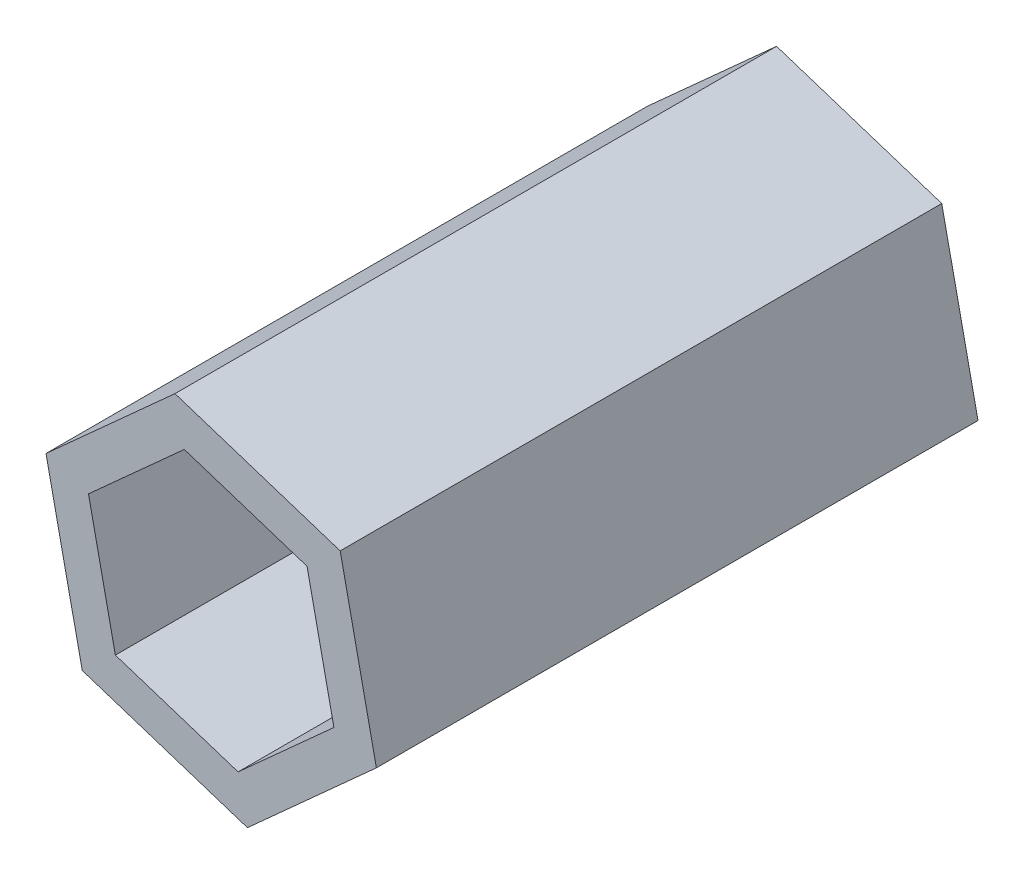
ISO-10303-21;
HEADER;
FILE_DESCRIPTION(('STEP AP214'),'2;1');
FILE_NAME('part.step','',(''),(''),'','','');
FILE_SCHEMA(('AUTOMOTIVE_DESIGN { 1 0 10303 214 1 1 1 1 }'));
ENDSEC;
DATA;
#1=APPLICATION_CONTEXT('core data for automotive mechanical design processes');
#2=APPLICATION_PROTOCOL_DEFINITION('international standard','automotive_design',2000,#1);
#3=PRODUCT_CONTEXT('',#1,'mechanical');
#4=PRODUCT('Part','Part','',(#3));
#5=PRODUCT_RELATED_PRODUCT_CATEGORY('part','',(#4));
#6=PRODUCT_DEFINITION_FORMATION('','',#4);
#7=PRODUCT_DEFINITION_CONTEXT('part definition',#1,'design');
#8=PRODUCT_DEFINITION('design','',#6,#7);
#9=PRODUCT_DEFINITION_SHAPE('','',#8);
#10=(LENGTH_UNIT() NAMED_UNIT(*) SI_UNIT(.MILLI.,.METRE.));
#11=(NAMED_UNIT(*) PLANE_ANGLE_UNIT() SI_UNIT($,.RADIAN.));
#12=(NAMED_UNIT(*) SI_UNIT($,.STERADIAN.) SOLID_ANGLE_UNIT());
#13=UNCERTAINTY_MEASURE_WITH_UNIT(LENGTH_MEASURE(1.E-05),#10,'distance_accuracy_value','');
#14=(GEOMETRIC_REPRESENTATION_CONTEXT(3) GLOBAL_UNCERTAINTY_ASSIGNED_CONTEXT((#13)) GLOBAL_UNIT_ASSIGNED_CONTEXT((#10,
#11,#12)) REPRESENTATION_CONTEXT('',''));
#15=CARTESIAN_POINT('',(0.,0.,0.));
#16=DIRECTION('',(0.,0.,1.));
#17=DIRECTION('',(1.,0.,0.));
#18=AXIS2_PLACEMENT_3D('',#15,#16,#17);
#19=CARTESIAN_POINT('',(3.00166839393673,2.70616337019305,14.));
#20=DIRECTION('',(-0.308413766503858,-0.95125230545366,0.));
#21=DIRECTION('',(0.95125230545366,-0.308413766503858,0.));
#22=AXIS2_PLACEMENT_3D('',#19,#20,#21);
#23=PLANE('',#22);
#24=DIRECTION('',(-0.95125230545366,0.308413766503858,0.));
#25=VECTOR('',#24,1.);
#26=CARTESIAN_POINT('',(3.00166839393673,2.70616337019305,0.));
#27=LINE('',#26,#25);
#28=CARTESIAN_POINT('',(3.00166839393673,2.70616337019305,0.));
#29=VERTEX_POINT('',#28);
#30=CARTESIAN_POINT('',(-0.842772028409732,3.95260276798257,0.));
#31=VERTEX_POINT('',#30);
#32=EDGE_CURVE('E129',#29,#31,#27,.T.);
#33=ORIENTED_EDGE('',*,*,#32,.T.);
#34=DIRECTION('',(0.,0.,-1.));
#35=VECTOR('',#34,1.);
#36=CARTESIAN_POINT('',(-0.842772028409732,3.95260276798257,14.));
#37=LINE('',#36,#35);
#38=CARTESIAN_POINT('',(-0.842772028409732,3.95260276798257,14.));
#39=VERTEX_POINT('',#38);
#40=EDGE_CURVE('E11',#39,#31,#37,.T.);
#41=ORIENTED_EDGE('',*,*,#40,.F.);
#42=DIRECTION('',(-0.95125230545366,0.308413766503858,0.));
#43=VECTOR('',#42,1.);
#44=CARTESIAN_POINT('',(3.00166839393673,2.70616337019305,14.));
#45=LINE('',#44,#43);
#46=CARTESIAN_POINT('',(3.00166839393673,2.70616337019305,14.));
#47=VERTEX_POINT('',#46);
#48=EDGE_CURVE('E141',#47,#39,#45,.T.);
#49=ORIENTED_EDGE('',*,*,#48,.F.);
#50=DIRECTION('',(0.,0.,-1.));
#51=VECTOR('',#50,1.);
#52=CARTESIAN_POINT('',(3.00166839393673,2.70616337019305,14.));
#53=LINE('',#52,#51);
#54=EDGE_CURVE('E125',#47,#29,#53,.T.);
#55=ORIENTED_EDGE('',*,*,#54,.T.);
#56=EDGE_LOOP('',(#33,#41,#49,#55));
#57=FACE_BOUND('',#56,.T.);
#58=ADVANCED_FACE('F33',(#57),#23,.F.);
#59=CARTESIAN_POINT('',(-0.842772028409732,3.95260276798257,14.));
#60=DIRECTION('',(0.669601778679456,-0.742720309396013,0.));
#61=DIRECTION('',(0.742720309396013,0.669601778679456,0.));
#62=AXIS2_PLACEMENT_3D('',#59,#60,#61);
#63=PLANE('',#62);
#64=DIRECTION('',(-0.742720309396013,-0.669601778679456,0.));
#65=VECTOR('',#64,1.);
#66=CARTESIAN_POINT('',(-0.842772028409732,3.95260276798257,0.));
#67=LINE('',#66,#65);
#68=CARTESIAN_POINT('',(-3.84444042234647,1.24643939778952,0.));
#69=VERTEX_POINT('',#68);
#70=EDGE_CURVE('E132',#31,#69,#67,.T.);
#71=ORIENTED_EDGE('',*,*,#70,.T.);
#72=DIRECTION('',(0.,0.,-1.));
#73=VECTOR('',#72,1.);
#74=CARTESIAN_POINT('',(-3.84444042234647,1.24643939778952,14.));
#75=LINE('',#74,#73);
#76=CARTESIAN_POINT('',(-3.84444042234647,1.24643939778952,14.));
#77=VERTEX_POINT('',#76);
#78=EDGE_CURVE('E40',#77,#69,#75,.T.);
#79=ORIENTED_EDGE('',*,*,#78,.F.);
#80=DIRECTION('',(-0.742720309396013,-0.669601778679456,0.));
#81=VECTOR('',#80,1.);
#82=CARTESIAN_POINT('',(-0.842772028409732,3.95260276798257,14.));
#83=LINE('',#82,#81);
#84=EDGE_CURVE('E91',#39,#77,#83,.T.);
#85=ORIENTED_EDGE('',*,*,#84,.F.);
#86=ORIENTED_EDGE('',*,*,#40,.T.);
#87=EDGE_LOOP('',(#71,#79,#85,#86));
#88=FACE_BOUND('',#87,.T.);
#89=ADVANCED_FACE('F229',(#88),#63,.F.);
#90=CARTESIAN_POINT('',(-3.84444042234647,1.24643939778952,14.));
#91=DIRECTION('',(0.978015545183313,0.208531996057647,0.));
#92=DIRECTION('',(-0.208531996057647,0.978015545183313,0.));
#93=AXIS2_PLACEMENT_3D('',#90,#91,#92);
#94=PLANE('',#93);
#95=DIRECTION('',(0.208531996057647,-0.978015545183313,0.));
#96=VECTOR('',#95,1.);
#97=CARTESIAN_POINT('',(-3.84444042234647,1.24643939778952,0.));
#98=LINE('',#97,#96);
#99=CARTESIAN_POINT('',(-3.00166839393674,-2.70616337019305,0.));
#100=VERTEX_POINT('',#99);
#101=EDGE_CURVE('E135',#69,#100,#98,.T.);
#102=ORIENTED_EDGE('',*,*,#101,.T.);
#103=DIRECTION('',(0.,0.,-1.));
#104=VECTOR('',#103,1.);
#105=CARTESIAN_POINT('',(-3.00166839393674,-2.70616337019305,14.));
#106=LINE('',#105,#104);
#107=CARTESIAN_POINT('',(-3.00166839393674,-2.70616337019305,14.));
#108=VERTEX_POINT('',#107);
#109=EDGE_CURVE('E120',#108,#100,#106,.T.);
#110=ORIENTED_EDGE('',*,*,#109,.F.);
#111=DIRECTION('',(0.208531996057647,-0.978015545183313,0.));
#112=VECTOR('',#111,1.);
#113=CARTESIAN_POINT('',(-3.84444042234647,1.24643939778952,14.));
#114=LINE('',#113,#112);
#115=EDGE_CURVE('E108',#77,#108,#114,.T.);
#116=ORIENTED_EDGE('',*,*,#115,.F.);
#117=ORIENTED_EDGE('',*,*,#78,.T.);
#118=EDGE_LOOP('',(#102,#110,#116,#117));
#119=FACE_BOUND('',#118,.T.);
#120=ADVANCED_FACE('F147',(#119),#94,.F.);
#121=CARTESIAN_POINT('',(-3.00166839393674,-2.70616337019305,14.));
#122=DIRECTION('',(0.308413766503858,0.95125230545366,0.));
#123=DIRECTION('',(-0.95125230545366,0.308413766503858,0.));
#124=AXIS2_PLACEMENT_3D('',#121,#122,#123);
#125=PLANE('',#124);
#126=DIRECTION('',(0.95125230545366,-0.308413766503858,0.));
#127=VECTOR('',#126,1.);
#128=CARTESIAN_POINT('',(-3.00166839393674,-2.70616337019305,0.));
#129=LINE('',#128,#127);
#130=CARTESIAN_POINT('',(0.842772028409723,-3.95260276798257,0.));
#131=VERTEX_POINT('',#130);
#132=EDGE_CURVE('E117',#100,#131,#129,.T.);
#133=ORIENTED_EDGE('',*,*,#132,.T.);
#134=DIRECTION('',(0.,0.,-1.));
#135=VECTOR('',#134,1.);
#136=CARTESIAN_POINT('',(0.842772028409723,-3.95260276798257,14.));
#137=LINE('',#136,#135);
#138=CARTESIAN_POINT('',(0.842772028409723,-3.95260276798257,14.));
#139=VERTEX_POINT('',#138);
#140=EDGE_CURVE('E114',#139,#131,#137,.T.);
#141=ORIENTED_EDGE('',*,*,#140,.F.);
#142=DIRECTION('',(0.95125230545366,-0.308413766503858,0.));
#143=VECTOR('',#142,1.);
#144=CARTESIAN_POINT('',(-3.00166839393674,-2.70616337019305,14.));
#145=LINE('',#144,#143);
#146=EDGE_CURVE('E101',#108,#139,#145,.T.);
#147=ORIENTED_EDGE('',*,*,#146,.F.);
#148=ORIENTED_EDGE('',*,*,#109,.T.);
#149=EDGE_LOOP('',(#133,#141,#147,#148));
#150=FACE_BOUND('',#149,.T.);
#151=ADVANCED_FACE('F115',(#150),#125,.F.);
#152=CARTESIAN_POINT('',(0.842772028409723,-3.95260276798257,14.));
#153=DIRECTION('',(-0.669601778679456,0.742720309396013,0.));
#154=DIRECTION('',(-0.742720309396013,-0.669601778679456,0.));
#155=AXIS2_PLACEMENT_3D('',#152,#153,#154);
#156=PLANE('',#155);
#157=DIRECTION('',(0.742720309396013,0.669601778679456,0.));
#158=VECTOR('',#157,1.);
#159=CARTESIAN_POINT('',(0.842772028409723,-3.95260276798257,0.));
#160=LINE('',#159,#158);
#161=CARTESIAN_POINT('',(3.84444042234646,-1.24643939778952,0.));
#162=VERTEX_POINT('',#161);
#163=EDGE_CURVE('E138',#131,#162,#160,.T.);
#164=ORIENTED_EDGE('',*,*,#163,.T.);
#165=DIRECTION('',(0.,0.,-1.));
#166=VECTOR('',#165,1.);
#167=CARTESIAN_POINT('',(3.84444042234646,-1.24643939778952,14.));
#168=LINE('',#167,#166);
#169=CARTESIAN_POINT('',(3.84444042234646,-1.24643939778952,14.));
#170=VERTEX_POINT('',#169);
#171=EDGE_CURVE('E121',#170,#162,#168,.T.);
#172=ORIENTED_EDGE('',*,*,#171,.F.);
#173=DIRECTION('',(0.742720309396013,0.669601778679456,0.));
#174=VECTOR('',#173,1.);
#175=CARTESIAN_POINT('',(0.842772028409723,-3.95260276798257,14.));
#176=LINE('',#175,#174);
#177=EDGE_CURVE('E105',#139,#170,#176,.T.);
#178=ORIENTED_EDGE('',*,*,#177,.F.);
#179=ORIENTED_EDGE('',*,*,#140,.T.);
#180=EDGE_LOOP('',(#164,#172,#178,#179));
#181=FACE_BOUND('',#180,.T.);
#182=ADVANCED_FACE('F123',(#181),#156,.F.);
#183=CARTESIAN_POINT('',(3.84444042234646,-1.24643939778952,14.));
#184=DIRECTION('',(-0.978015545183313,-0.208531996057647,0.));
#185=DIRECTION('',(0.208531996057647,-0.978015545183313,0.));
#186=AXIS2_PLACEMENT_3D('',#183,#184,#185);
#187=PLANE('',#186);
#188=DIRECTION('',(-0.208531996057647,0.978015545183313,0.));
#189=VECTOR('',#188,1.);
#190=CARTESIAN_POINT('',(3.84444042234646,-1.24643939778952,0.));
#191=LINE('',#190,#189);
#192=EDGE_CURVE('E83',#162,#29,#191,.T.);
#193=ORIENTED_EDGE('',*,*,#192,.T.);
#194=ORIENTED_EDGE('',*,*,#54,.F.);
#195=DIRECTION('',(-0.208531996057647,0.978015545183313,0.));
#196=VECTOR('',#195,1.);
#197=CARTESIAN_POINT('',(3.84444042234646,-1.24643939778952,14.));
#198=LINE('',#197,#196);
#199=EDGE_CURVE('E56',#170,#47,#198,.T.);
#200=ORIENTED_EDGE('',*,*,#199,.F.);
#201=ORIENTED_EDGE('',*,*,#171,.T.);
#202=EDGE_LOOP('',(#193,#194,#200,#201));
#203=FACE_BOUND('',#202,.T.);
#204=ADVANCED_FACE('F151',(#203),#187,.F.);
#205=CARTESIAN_POINT('',(0.,0.,14.));
#206=DIRECTION('',(0.,0.,1.));
#207=DIRECTION('',(1.,0.,0.));
#208=AXIS2_PLACEMENT_3D('',#205,#206,#207);
#209=PLANE('',#208);
#210=DIRECTION('',(-0.208531996057655,0.978015545183312,0.));
#211=VECTOR('',#210,1.);
#212=CARTESIAN_POINT('',(2.85587002802881,-0.925926409786481,14.));
#213=LINE('',#212,#211);
#214=CARTESIAN_POINT('',(2.85587002802881,-0.925926409786481,14.));
#215=VERTEX_POINT('',#214);
#216=CARTESIAN_POINT('',(2.22981080692441,2.01029278928628,14.));
#217=VERTEX_POINT('',#216);
#218=EDGE_CURVE('E47',#215,#217,#213,.T.);
#219=ORIENTED_EDGE('',*,*,#218,.F.);
#220=DIRECTION('',(0.742720309396008,0.669601778679461,0.));
#221=VECTOR('',#220,1.);
#222=CARTESIAN_POINT('',(0.626059221104392,-2.93621919907276,14.));
#223=LINE('',#222,#221);
#224=CARTESIAN_POINT('',(0.626059221104392,-2.93621919907276,14.));
#225=VERTEX_POINT('',#224);
#226=EDGE_CURVE('E174',#225,#215,#223,.T.);
#227=ORIENTED_EDGE('',*,*,#226,.F.);
#228=DIRECTION('',(0.951252305453663,-0.308413766503851,0.));
#229=VECTOR('',#228,1.);
#230=CARTESIAN_POINT('',(-2.22981080692441,-2.01029278928628,14.));
#231=LINE('',#230,#229);
#232=CARTESIAN_POINT('',(-2.22981080692441,-2.01029278928628,14.));
#233=VERTEX_POINT('',#232);
#234=EDGE_CURVE('E178',#233,#225,#231,.T.);
#235=ORIENTED_EDGE('',*,*,#234,.F.);
#236=DIRECTION('',(0.208531996057654,-0.978015545183312,0.));
#237=VECTOR('',#236,1.);
#238=CARTESIAN_POINT('',(-2.85587002802881,0.925926409786481,14.));
#239=LINE('',#238,#237);
#240=CARTESIAN_POINT('',(-2.85587002802881,0.925926409786481,14.));
#241=VERTEX_POINT('',#240);
#242=EDGE_CURVE('E181',#241,#233,#239,.T.);
#243=ORIENTED_EDGE('',*,*,#242,.F.);
#244=DIRECTION('',(-0.742720309396009,-0.669601778679461,0.));
#245=VECTOR('',#244,1.);
#246=CARTESIAN_POINT('',(-0.62605922110439,2.93621919907276,14.));
#247=LINE('',#246,#245);
#248=CARTESIAN_POINT('',(-0.62605922110439,2.93621919907276,14.));
#249=VERTEX_POINT('',#248);
#250=EDGE_CURVE('E184',#249,#241,#247,.T.);
#251=ORIENTED_EDGE('',*,*,#250,.F.);
#252=DIRECTION('',(-0.951252305453662,0.308413766503851,0.));
#253=VECTOR('',#252,1.);
#254=CARTESIAN_POINT('',(2.22981080692441,2.01029278928628,14.));
#255=LINE('',#254,#253);
#256=EDGE_CURVE('E187',#217,#249,#255,.T.);
#257=ORIENTED_EDGE('',*,*,#256,.F.);
#258=EDGE_LOOP('',(#219,#227,#235,#243,#251,#257));
#259=FACE_BOUND('',#258,.T.);
#260=ORIENTED_EDGE('',*,*,#48,.T.);
#261=ORIENTED_EDGE('',*,*,#84,.T.);
#262=ORIENTED_EDGE('',*,*,#115,.T.);
#263=ORIENTED_EDGE('',*,*,#146,.T.);
#264=ORIENTED_EDGE('',*,*,#177,.T.);
#265=ORIENTED_EDGE('',*,*,#199,.T.);
#266=EDGE_LOOP('',(#260,#261,#262,#263,#264,#265));
#267=FACE_BOUND('',#266,.T.);
#268=ADVANCED_FACE('F103',(#259,#267),#209,.T.);
#269=CARTESIAN_POINT('',(0.,0.,0.));
#270=DIRECTION('',(0.,0.,1.));
#271=DIRECTION('',(1.,0.,0.));
#272=AXIS2_PLACEMENT_3D('',#269,#270,#271);
#273=PLANE('',#272);
#274=CARTESIAN_POINT('',(0.,0.,0.));
#275=DIRECTION('',(0.,0.,-1.));
#276=DIRECTION('',(-1.,0.,0.));
#277=AXIS2_PLACEMENT_3D('',#274,#275,#276);
#278=CIRCLE('',#277,0.75);
#279=CARTESIAN_POINT('',(-0.75,0.,0.));
#280=VERTEX_POINT('',#279);
#281=EDGE_CURVE('E191',#280,#280,#278,.T.);
#282=ORIENTED_EDGE('',*,*,#281,.F.);
#283=EDGE_LOOP('',(#282));
#284=FACE_BOUND('',#283,.T.);
#285=ORIENTED_EDGE('',*,*,#32,.F.);
#286=ORIENTED_EDGE('',*,*,#192,.F.);
#287=ORIENTED_EDGE('',*,*,#163,.F.);
#288=ORIENTED_EDGE('',*,*,#132,.F.);
#289=ORIENTED_EDGE('',*,*,#101,.F.);
#290=ORIENTED_EDGE('',*,*,#70,.F.);
#291=EDGE_LOOP('',(#285,#286,#287,#288,#289,#290));
#292=FACE_BOUND('',#291,.T.);
#293=ADVANCED_FACE('F150',(#284,#292),#273,.F.);
#294=CARTESIAN_POINT('',(2.85587002802881,-0.925926409786481,3.4));
#295=DIRECTION('',(0.978015545183312,0.208531996057655,0.));
#296=DIRECTION('',(-0.208531996057655,0.978015545183312,0.));
#297=AXIS2_PLACEMENT_3D('',#294,#295,#296);
#298=PLANE('',#297);
#299=ORIENTED_EDGE('',*,*,#218,.T.);
#300=DIRECTION('',(0.,0.,1.));
#301=VECTOR('',#300,1.);
#302=CARTESIAN_POINT('',(2.22981080692441,2.01029278928628,3.4));
#303=LINE('',#302,#301);
#304=CARTESIAN_POINT('',(2.22981080692441,2.01029278928628,3.4));
#305=VERTEX_POINT('',#304);
#306=EDGE_CURVE('E158',#305,#217,#303,.T.);
#307=ORIENTED_EDGE('',*,*,#306,.F.);
#308=DIRECTION('',(-0.208531996057655,0.978015545183312,0.));
#309=VECTOR('',#308,1.);
#310=CARTESIAN_POINT('',(2.85587002802881,-0.925926409786481,3.4));
#311=LINE('',#310,#309);
#312=CARTESIAN_POINT('',(2.85587002802881,-0.925926409786481,3.4));
#313=VERTEX_POINT('',#312);
#314=EDGE_CURVE('E177',#313,#305,#311,.T.);
#315=ORIENTED_EDGE('',*,*,#314,.F.);
#316=DIRECTION('',(0.,0.,1.));
#317=VECTOR('',#316,1.);
#318=CARTESIAN_POINT('',(2.85587002802881,-0.925926409786481,3.4));
#319=LINE('',#318,#317);
#320=EDGE_CURVE('E133',#313,#215,#319,.T.);
#321=ORIENTED_EDGE('',*,*,#320,.T.);
#322=EDGE_LOOP('',(#299,#307,#315,#321));
#323=FACE_BOUND('',#322,.T.);
#324=ADVANCED_FACE('F217',(#323),#298,.F.);
#325=CARTESIAN_POINT('',(0.626059221104392,-2.93621919907276,3.4));
#326=DIRECTION('',(0.669601778679461,-0.742720309396008,0.));
#327=DIRECTION('',(0.742720309396009,0.669601778679461,0.));
#328=AXIS2_PLACEMENT_3D('',#325,#326,#327);
#329=PLANE('',#328);
#330=ORIENTED_EDGE('',*,*,#226,.T.);
#331=ORIENTED_EDGE('',*,*,#320,.F.);
#332=DIRECTION('',(0.742720309396008,0.669601778679461,0.));
#333=VECTOR('',#332,1.);
#334=CARTESIAN_POINT('',(0.626059221104392,-2.93621919907276,3.4));
#335=LINE('',#334,#333);
#336=CARTESIAN_POINT('',(0.626059221104392,-2.93621919907276,3.4));
#337=VERTEX_POINT('',#336);
#338=EDGE_CURVE('E161',#337,#313,#335,.T.);
#339=ORIENTED_EDGE('',*,*,#338,.F.);
#340=DIRECTION('',(0.,0.,1.));
#341=VECTOR('',#340,1.);
#342=CARTESIAN_POINT('',(0.626059221104392,-2.93621919907276,3.4));
#343=LINE('',#342,#341);
#344=EDGE_CURVE('E170',#337,#225,#343,.T.);
#345=ORIENTED_EDGE('',*,*,#344,.T.);
#346=EDGE_LOOP('',(#330,#331,#339,#345));
#347=FACE_BOUND('',#346,.T.);
#348=ADVANCED_FACE('F223',(#347),#329,.F.);
#349=CARTESIAN_POINT('',(-2.22981080692441,-2.01029278928628,3.4));
#350=DIRECTION('',(-0.308413766503851,-0.951252305453663,0.));
#351=DIRECTION('',(0.951252305453663,-0.308413766503851,0.));
#352=AXIS2_PLACEMENT_3D('',#349,#350,#351);
#353=PLANE('',#352);
#354=ORIENTED_EDGE('',*,*,#234,.T.);
#355=ORIENTED_EDGE('',*,*,#344,.F.);
#356=DIRECTION('',(0.951252305453663,-0.308413766503851,0.));
#357=VECTOR('',#356,1.);
#358=CARTESIAN_POINT('',(-2.22981080692441,-2.01029278928628,3.4));
#359=LINE('',#358,#357);
#360=CARTESIAN_POINT('',(-2.22981080692441,-2.01029278928628,3.4));
#361=VERTEX_POINT('',#360);
#362=EDGE_CURVE('E194',#361,#337,#359,.T.);
#363=ORIENTED_EDGE('',*,*,#362,.F.);
#364=DIRECTION('',(0.,0.,1.));
#365=VECTOR('',#364,1.);
#366=CARTESIAN_POINT('',(-2.22981080692441,-2.01029278928628,3.4));
#367=LINE('',#366,#365);
#368=EDGE_CURVE('E167',#361,#233,#367,.T.);
#369=ORIENTED_EDGE('',*,*,#368,.T.);
#370=EDGE_LOOP('',(#354,#355,#363,#369));
#371=FACE_BOUND('',#370,.T.);
#372=ADVANCED_FACE('F266',(#371),#353,.F.);
#373=CARTESIAN_POINT('',(-2.85587002802881,0.925926409786481,3.4));
#374=DIRECTION('',(-0.978015545183312,-0.208531996057654,0.));
#375=DIRECTION('',(0.208531996057654,-0.978015545183312,0.));
#376=AXIS2_PLACEMENT_3D('',#373,#374,#375);
#377=PLANE('',#376);
#378=ORIENTED_EDGE('',*,*,#242,.T.);
#379=ORIENTED_EDGE('',*,*,#368,.F.);
#380=DIRECTION('',(0.208531996057654,-0.978015545183312,0.));
#381=VECTOR('',#380,1.);
#382=CARTESIAN_POINT('',(-2.85587002802881,0.925926409786481,3.4));
#383=LINE('',#382,#381);
#384=CARTESIAN_POINT('',(-2.85587002802881,0.925926409786481,3.4));
#385=VERTEX_POINT('',#384);
#386=EDGE_CURVE('E197',#385,#361,#383,.T.);
#387=ORIENTED_EDGE('',*,*,#386,.F.);
#388=DIRECTION('',(0.,0.,1.));
#389=VECTOR('',#388,1.);
#390=CARTESIAN_POINT('',(-2.85587002802881,0.925926409786481,3.4));
#391=LINE('',#390,#389);
#392=EDGE_CURVE('E164',#385,#241,#391,.T.);
#393=ORIENTED_EDGE('',*,*,#392,.T.);
#394=EDGE_LOOP('',(#378,#379,#387,#393));
#395=FACE_BOUND('',#394,.T.);
#396=ADVANCED_FACE('F276',(#395),#377,.F.);
#397=CARTESIAN_POINT('',(-0.62605922110439,2.93621919907276,3.4));
#398=DIRECTION('',(-0.669601778679461,0.742720309396009,0.));
#399=DIRECTION('',(-0.742720309396009,-0.669601778679461,0.));
#400=AXIS2_PLACEMENT_3D('',#397,#398,#399);
#401=PLANE('',#400);
#402=ORIENTED_EDGE('',*,*,#250,.T.);
#403=ORIENTED_EDGE('',*,*,#392,.F.);
#404=DIRECTION('',(-0.742720309396009,-0.669601778679461,0.));
#405=VECTOR('',#404,1.);
#406=CARTESIAN_POINT('',(-0.62605922110439,2.93621919907276,3.4));
#407=LINE('',#406,#405);
#408=CARTESIAN_POINT('',(-0.62605922110439,2.93621919907276,3.4));
#409=VERTEX_POINT('',#408);
#410=EDGE_CURVE('E200',#409,#385,#407,.T.);
#411=ORIENTED_EDGE('',*,*,#410,.F.);
#412=DIRECTION('',(0.,0.,1.));
#413=VECTOR('',#412,1.);
#414=CARTESIAN_POINT('',(-0.62605922110439,2.93621919907276,3.4));
#415=LINE('',#414,#413);
#416=EDGE_CURVE('E160',#409,#249,#415,.T.);
#417=ORIENTED_EDGE('',*,*,#416,.T.);
#418=EDGE_LOOP('',(#402,#403,#411,#417));
#419=FACE_BOUND('',#418,.T.);
#420=ADVANCED_FACE('F286',(#419),#401,.F.);
#421=CARTESIAN_POINT('',(2.22981080692441,2.01029278928628,3.4));
#422=DIRECTION('',(0.308413766503851,0.951252305453662,0.));
#423=DIRECTION('',(-0.951252305453663,0.308413766503851,0.));
#424=AXIS2_PLACEMENT_3D('',#421,#422,#423);
#425=PLANE('',#424);
#426=ORIENTED_EDGE('',*,*,#256,.T.);
#427=ORIENTED_EDGE('',*,*,#416,.F.);
#428=DIRECTION('',(-0.951252305453662,0.308413766503851,0.));
#429=VECTOR('',#428,1.);
#430=CARTESIAN_POINT('',(2.22981080692441,2.01029278928628,3.4));
#431=LINE('',#430,#429);
#432=EDGE_CURVE('E203',#305,#409,#431,.T.);
#433=ORIENTED_EDGE('',*,*,#432,.F.);
#434=ORIENTED_EDGE('',*,*,#306,.T.);
#435=EDGE_LOOP('',(#426,#427,#433,#434));
#436=FACE_BOUND('',#435,.T.);
#437=ADVANCED_FACE('F296',(#436),#425,.F.);
#438=CARTESIAN_POINT('',(0.,0.,3.4));
#439=DIRECTION('',(0.,0.,1.));
#440=DIRECTION('',(1.,0.,0.));
#441=AXIS2_PLACEMENT_3D('',#438,#439,#440);
#442=PLANE('',#441);
#443=CARTESIAN_POINT('',(0.,0.,3.4));
#444=DIRECTION('',(0.,0.,1.));
#445=DIRECTION('',(1.,0.,0.));
#446=AXIS2_PLACEMENT_3D('',#443,#444,#445);
#447=CIRCLE('',#446,0.75);
#448=CARTESIAN_POINT('',(-0.75,0.,3.4));
#449=VERTEX_POINT('',#448);
#450=EDGE_CURVE('E208',#449,#449,#447,.F.);
#451=ORIENTED_EDGE('',*,*,#450,.T.);
#452=EDGE_LOOP('',(#451));
#453=FACE_BOUND('',#452,.T.);
#454=ORIENTED_EDGE('',*,*,#314,.T.);
#455=ORIENTED_EDGE('',*,*,#432,.T.);
#456=ORIENTED_EDGE('',*,*,#410,.T.);
#457=ORIENTED_EDGE('',*,*,#386,.T.);
#458=ORIENTED_EDGE('',*,*,#362,.T.);
#459=ORIENTED_EDGE('',*,*,#338,.T.);
#460=EDGE_LOOP('',(#454,#455,#456,#457,#458,#459));
#461=FACE_BOUND('',#460,.T.);
#462=ADVANCED_FACE('F305',(#453,#461),#442,.T.);
#463=CARTESIAN_POINT('',(0.,0.,14.001));
#464=DIRECTION('',(0.,0.,-1.));
#465=DIRECTION('',(-1.,0.,0.));
#466=AXIS2_PLACEMENT_3D('',#463,#464,#465);
#467=CYLINDRICAL_SURFACE('',#466,0.75);
#468=CARTESIAN_POINT('',(-0.75,0.,3.4));
#469=CARTESIAN_POINT('',(-0.75,0.,3.36458333333333));
#470=CARTESIAN_POINT('',(-0.75,0.,3.32916666666666));
#471=CARTESIAN_POINT('',(-0.75,0.,3.25833333333333));
#472=CARTESIAN_POINT('',(-0.75,0.,3.22291666666667));
#473=CARTESIAN_POINT('',(-0.75,0.,3.15208333333333));
#474=CARTESIAN_POINT('',(-0.75,0.,3.11666666666667));
#475=CARTESIAN_POINT('',(-0.75,0.,3.04583333333333));
#476=CARTESIAN_POINT('',(-0.75,0.,3.01041666666667));
#477=CARTESIAN_POINT('',(-0.75,0.,2.93958333333333));
#478=CARTESIAN_POINT('',(-0.75,0.,2.90416666666667));
#479=CARTESIAN_POINT('',(-0.75,0.,2.83333333333333));
#480=CARTESIAN_POINT('',(-0.75,0.,2.79791666666667));
#481=CARTESIAN_POINT('',(-0.75,0.,2.72708333333333));
#482=CARTESIAN_POINT('',(-0.75,0.,2.69166666666667));
#483=CARTESIAN_POINT('',(-0.75,0.,2.62083333333333));
#484=CARTESIAN_POINT('',(-0.75,0.,2.58541666666666));
#485=CARTESIAN_POINT('',(-0.75,0.,2.51458333333333));
#486=CARTESIAN_POINT('',(-0.75,0.,2.47916666666667));
#487=CARTESIAN_POINT('',(-0.75,0.,2.40833333333333));
#488=CARTESIAN_POINT('',(-0.75,0.,2.37291666666667));
#489=CARTESIAN_POINT('',(-0.75,0.,2.30208333333333));
#490=CARTESIAN_POINT('',(-0.75,0.,2.26666666666667));
#491=CARTESIAN_POINT('',(-0.75,0.,2.19583333333333));
#492=CARTESIAN_POINT('',(-0.75,0.,2.16041666666667));
#493=CARTESIAN_POINT('',(-0.75,0.,2.08958333333333));
#494=CARTESIAN_POINT('',(-0.75,0.,2.05416666666667));
#495=CARTESIAN_POINT('',(-0.75,0.,1.98333333333333));
#496=CARTESIAN_POINT('',(-0.75,0.,1.94791666666667));
#497=CARTESIAN_POINT('',(-0.75,0.,1.87708333333333));
#498=CARTESIAN_POINT('',(-0.75,0.,1.84166666666667));
#499=CARTESIAN_POINT('',(-0.75,0.,1.77083333333333));
#500=CARTESIAN_POINT('',(-0.75,0.,1.73541666666667));
#501=CARTESIAN_POINT('',(-0.75,0.,1.66458333333333));
#502=CARTESIAN_POINT('',(-0.75,0.,1.62916666666667));
#503=CARTESIAN_POINT('',(-0.75,0.,1.55833333333333));
#504=CARTESIAN_POINT('',(-0.75,0.,1.52291666666667));
#505=CARTESIAN_POINT('',(-0.75,0.,1.45208333333333));
#506=CARTESIAN_POINT('',(-0.75,0.,1.41666666666667));
#507=CARTESIAN_POINT('',(-0.75,0.,1.34583333333333));
#508=CARTESIAN_POINT('',(-0.75,0.,1.31041666666667));
#509=CARTESIAN_POINT('',(-0.75,0.,1.23958333333333));
#510=CARTESIAN_POINT('',(-0.75,0.,1.20416666666667));
#511=CARTESIAN_POINT('',(-0.75,0.,1.13333333333333));
#512=CARTESIAN_POINT('',(-0.75,0.,1.09791666666667));
#513=CARTESIAN_POINT('',(-0.75,0.,1.02708333333333));
#514=CARTESIAN_POINT('',(-0.75,0.,0.991666666666667));
#515=CARTESIAN_POINT('',(-0.75,0.,0.920833333333334));
#516=CARTESIAN_POINT('',(-0.75,0.,0.885416666666668));
#517=CARTESIAN_POINT('',(-0.75,0.,0.814583333333335));
#518=CARTESIAN_POINT('',(-0.75,0.,0.779166666666668));
#519=CARTESIAN_POINT('',(-0.75,0.,0.708333333333335));
#520=CARTESIAN_POINT('',(-0.75,0.,0.672916666666668));
#521=CARTESIAN_POINT('',(-0.75,0.,0.602083333333335));
#522=CARTESIAN_POINT('',(-0.75,0.,0.566666666666668));
#523=CARTESIAN_POINT('',(-0.75,0.,0.495833333333335));
#524=CARTESIAN_POINT('',(-0.75,0.,0.460416666666669));
#525=CARTESIAN_POINT('',(-0.75,0.,0.389583333333335));
#526=CARTESIAN_POINT('',(-0.75,0.,0.354166666666668));
#527=CARTESIAN_POINT('',(-0.75,0.,0.283333333333335));
#528=CARTESIAN_POINT('',(-0.75,0.,0.247916666666669));
#529=CARTESIAN_POINT('',(-0.75,0.,0.177083333333336));
#530=CARTESIAN_POINT('',(-0.75,0.,0.141666666666669));
#531=CARTESIAN_POINT('',(-0.75,0.,0.0708333333333354));
#532=CARTESIAN_POINT('',(-0.75,0.,0.0354166666666685));
#533=CARTESIAN_POINT('',(-0.75,0.,0.));
#534=B_SPLINE_CURVE_WITH_KNOTS('',3,(#468,#469,#470,#471,#472,#473,#474,#475,#476,#477,#478,
#479,#480,#481,#482,#483,#484,#485,#486,#487,#488,#489,#490,#491,#492,#493,#494,#495,#496,#497,
#498,#499,#500,#501,#502,#503,#504,#505,#506,#507,#508,#509,#510,#511,#512,#513,#514,#515,#516,
#517,#518,#519,#520,#521,#522,#523,#524,#525,#526,#527,#528,#529,#530,#531,#532,#533),
.UNSPECIFIED.,.F.,.F.,(4,2,2,2,2,2,2,2,2,2,2,2,2,2,2,2,2,2,2,2,2,2,2,2,2,2,2,2,2,2,2,2,4),(0.,
0.10625,0.212499999999999,0.31875,0.425,0.531249999999999,0.637499999999999,0.74375,0.85,
0.956249999999999,1.0625,1.16875,1.275,1.38125,1.4875,1.59375,1.7,1.80625,1.9125,2.01875,2.125,
2.23125,2.3375,2.44375,2.55,2.65625,2.7625,2.86875,2.975,3.08125,3.1875,3.29375,3.4),.UNSPECIFIED.);
#535=EDGE_CURVE('BSEAM214',#449,#280,#534,.T.);
#536=ORIENTED_EDGE('',*,*,#450,.F.);
#537=ORIENTED_EDGE('',*,*,#281,.T.);
#538=ORIENTED_EDGE('',*,*,#535,.T.);
#539=ORIENTED_EDGE('',*,*,#535,.F.);
#540=EDGE_LOOP('',(#536,#538,#537,#539));
#541=FACE_BOUND('',#540,.T.);
#542=ADVANCED_FACE('F214',(#541),#467,.F.);
#543=CLOSED_SHELL('',(#58,#89,#120,#151,#182,#204,#268,#293,#324,#348,#372,#396,#420,#437,#462,#542));
#544=MANIFOLD_SOLID_BREP('B2',#543);
#545=ADVANCED_BREP_SHAPE_REPRESENTATION('',(#18,#544),#14);
#546=SHAPE_DEFINITION_REPRESENTATION(#9,#545);
ENDSEC;
END-ISO-10303-21;
